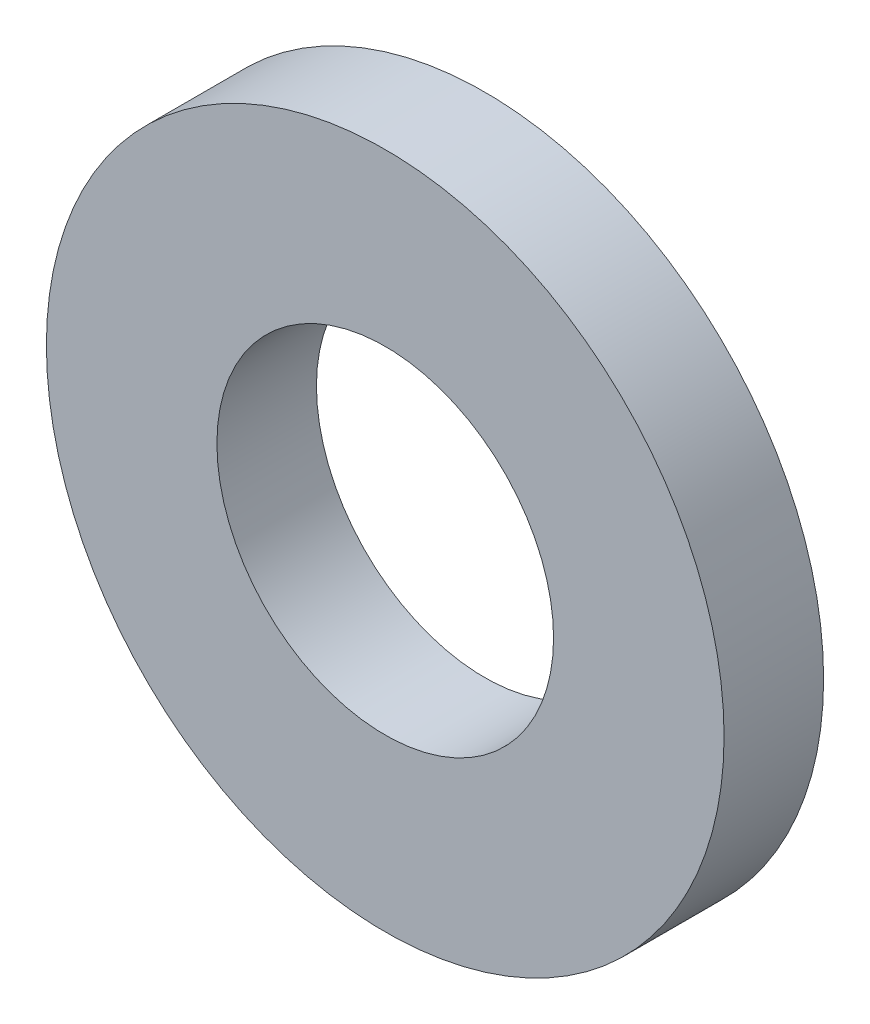
ISO-10303-21;
HEADER;
FILE_DESCRIPTION(('STEP AP214'),'2;1');
FILE_NAME('part.step','',(''),(''),'','','');
FILE_SCHEMA(('AUTOMOTIVE_DESIGN { 1 0 10303 214 1 1 1 1 }'));
ENDSEC;
DATA;
#1=APPLICATION_CONTEXT('core data for automotive mechanical design processes');
#2=APPLICATION_PROTOCOL_DEFINITION('international standard','automotive_design',2000,#1);
#3=PRODUCT_CONTEXT('',#1,'mechanical');
#4=PRODUCT('Part','Part','',(#3));
#5=PRODUCT_RELATED_PRODUCT_CATEGORY('part','',(#4));
#6=PRODUCT_DEFINITION_FORMATION('','',#4);
#7=PRODUCT_DEFINITION_CONTEXT('part definition',#1,'design');
#8=PRODUCT_DEFINITION('design','',#6,#7);
#9=PRODUCT_DEFINITION_SHAPE('','',#8);
#10=(LENGTH_UNIT() NAMED_UNIT(*) SI_UNIT(.MILLI.,.METRE.));
#11=(NAMED_UNIT(*) PLANE_ANGLE_UNIT() SI_UNIT($,.RADIAN.));
#12=(NAMED_UNIT(*) SI_UNIT($,.STERADIAN.) SOLID_ANGLE_UNIT());
#13=UNCERTAINTY_MEASURE_WITH_UNIT(LENGTH_MEASURE(1.E-05),#10,'distance_accuracy_value','');
#14=(GEOMETRIC_REPRESENTATION_CONTEXT(3) GLOBAL_UNCERTAINTY_ASSIGNED_CONTEXT((#13)) GLOBAL_UNIT_ASSIGNED_CONTEXT((#10,
#11,#12)) REPRESENTATION_CONTEXT('',''));
#15=CARTESIAN_POINT('',(0.,0.,0.));
#16=DIRECTION('',(0.,0.,1.));
#17=DIRECTION('',(1.,0.,0.));
#18=AXIS2_PLACEMENT_3D('',#15,#16,#17);
#19=CARTESIAN_POINT('',(0.,0.,0.68));
#20=DIRECTION('',(0.,0.,1.));
#21=DIRECTION('',(1.,0.,0.));
#22=AXIS2_PLACEMENT_3D('',#19,#20,#21);
#23=PLANE('',#22);
#24=CARTESIAN_POINT('',(0.,0.,0.68));
#25=DIRECTION('',(0.,0.,1.));
#26=DIRECTION('',(1.,0.,0.));
#27=AXIS2_PLACEMENT_3D('',#24,#25,#26);
#28=CIRCLE('',#27,2.315);
#29=CARTESIAN_POINT('',(2.315,0.,0.68));
#30=VERTEX_POINT('',#29);
#31=EDGE_CURVE('E10',#30,#30,#28,.T.);
#32=ORIENTED_EDGE('',*,*,#31,.T.);
#33=EDGE_LOOP('',(#32));
#34=FACE_BOUND('',#33,.T.);
#35=CARTESIAN_POINT('',(0.,0.,0.68));
#36=DIRECTION('',(0.,0.,1.));
#37=DIRECTION('',(1.,0.,0.));
#38=AXIS2_PLACEMENT_3D('',#35,#36,#37);
#39=CIRCLE('',#38,1.15);
#40=CARTESIAN_POINT('',(1.15,0.,0.68));
#41=VERTEX_POINT('',#40);
#42=EDGE_CURVE('E46',#41,#41,#39,.T.);
#43=ORIENTED_EDGE('',*,*,#42,.F.);
#44=EDGE_LOOP('',(#43));
#45=FACE_BOUND('',#44,.T.);
#46=ADVANCED_FACE('F35',(#34,#45),#23,.T.);
#47=CARTESIAN_POINT('',(0.,0.,0.));
#48=DIRECTION('',(0.,0.,1.));
#49=DIRECTION('',(1.,0.,0.));
#50=AXIS2_PLACEMENT_3D('',#47,#48,#49);
#51=PLANE('',#50);
#52=CARTESIAN_POINT('',(0.,0.,0.));
#53=DIRECTION('',(0.,0.,1.));
#54=DIRECTION('',(1.,0.,0.));
#55=AXIS2_PLACEMENT_3D('',#52,#53,#54);
#56=CIRCLE('',#55,2.315);
#57=CARTESIAN_POINT('',(2.315,0.,0.));
#58=VERTEX_POINT('',#57);
#59=EDGE_CURVE('E39',#58,#58,#56,.T.);
#60=ORIENTED_EDGE('',*,*,#59,.F.);
#61=EDGE_LOOP('',(#60));
#62=FACE_BOUND('',#61,.T.);
#63=CARTESIAN_POINT('',(0.,0.,0.));
#64=DIRECTION('',(0.,0.,1.));
#65=DIRECTION('',(1.,0.,0.));
#66=AXIS2_PLACEMENT_3D('',#63,#64,#65);
#67=CIRCLE('',#66,1.15);
#68=CARTESIAN_POINT('',(1.15,0.,0.));
#69=VERTEX_POINT('',#68);
#70=EDGE_CURVE('E48',#69,#69,#67,.T.);
#71=ORIENTED_EDGE('',*,*,#70,.T.);
#72=EDGE_LOOP('',(#71));
#73=FACE_BOUND('',#72,.T.);
#74=ADVANCED_FACE('F58',(#62,#73),#51,.F.);
#75=CARTESIAN_POINT('',(0.,0.,0.68));
#76=DIRECTION('',(0.,0.,-1.));
#77=DIRECTION('',(-1.,0.,0.));
#78=AXIS2_PLACEMENT_3D('',#75,#76,#77);
#79=CYLINDRICAL_SURFACE('',#78,2.315);
#80=ORIENTED_EDGE('',*,*,#31,.F.);
#81=EDGE_LOOP('',(#80));
#82=FACE_BOUND('',#81,.T.);
#83=ORIENTED_EDGE('',*,*,#59,.T.);
#84=EDGE_LOOP('',(#83));
#85=FACE_BOUND('',#84,.T.);
#86=ADVANCED_FACE('F37',(#82,#85),#79,.T.);
#87=CARTESIAN_POINT('',(0.,0.,0.68));
#88=DIRECTION('',(0.,0.,-1.));
#89=DIRECTION('',(-1.,0.,0.));
#90=AXIS2_PLACEMENT_3D('',#87,#88,#89);
#91=CYLINDRICAL_SURFACE('',#90,1.15);
#92=ORIENTED_EDGE('',*,*,#42,.T.);
#93=EDGE_LOOP('',(#92));
#94=FACE_BOUND('',#93,.T.);
#95=ORIENTED_EDGE('',*,*,#70,.F.);
#96=EDGE_LOOP('',(#95));
#97=FACE_BOUND('',#96,.T.);
#98=ADVANCED_FACE('F54',(#94,#97),#91,.F.);
#99=CLOSED_SHELL('',(#46,#74,#86,#98));
#100=MANIFOLD_SOLID_BREP('B2',#99);
#101=ADVANCED_BREP_SHAPE_REPRESENTATION('',(#18,#100),#14);
#102=SHAPE_DEFINITION_REPRESENTATION(#9,#101);
ENDSEC;
END-ISO-10303-21;
